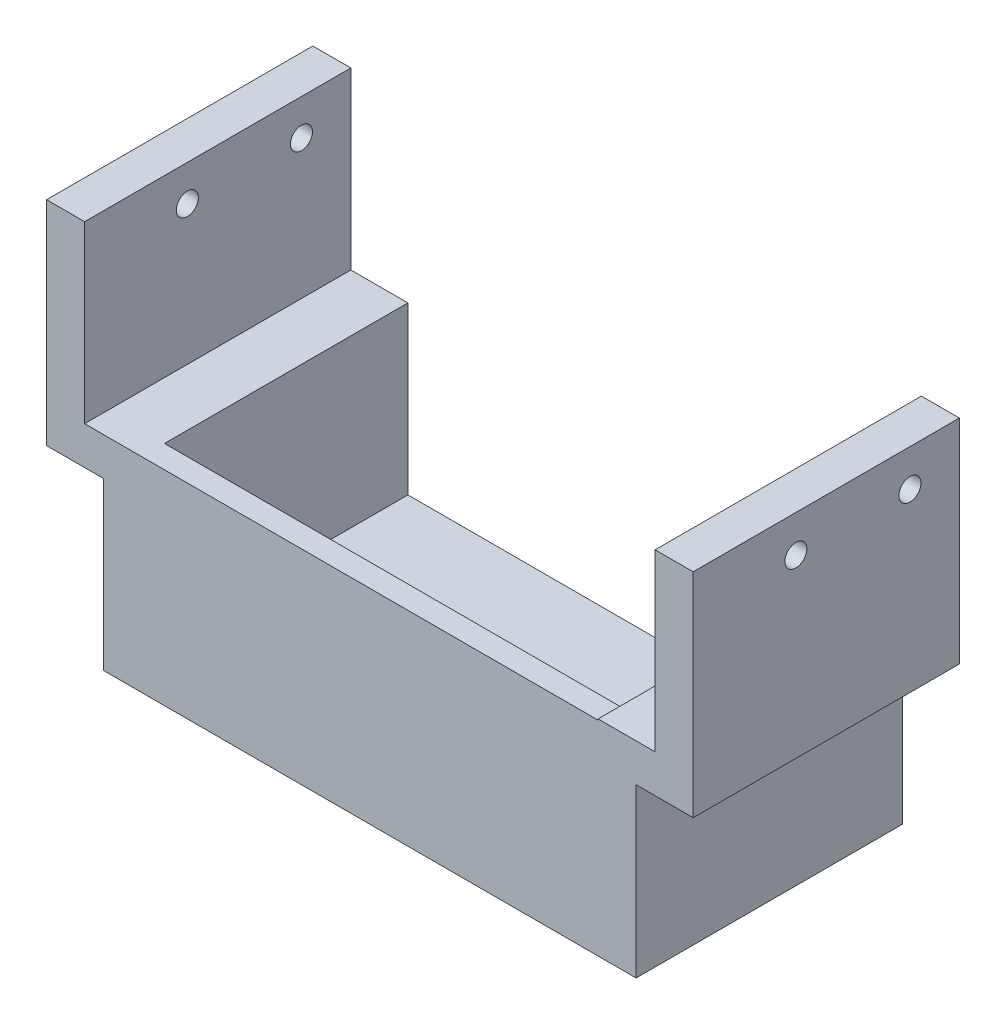
ISO-10303-21;
HEADER;
FILE_DESCRIPTION(('STEP AP214'),'2;1');
FILE_NAME('part.step','',(''),(''),'','','');
FILE_SCHEMA(('AUTOMOTIVE_DESIGN { 1 0 10303 214 1 1 1 1 }'));
ENDSEC;
DATA;
#1=APPLICATION_CONTEXT('core data for automotive mechanical design processes');
#2=APPLICATION_PROTOCOL_DEFINITION('international standard','automotive_design',2000,#1);
#3=PRODUCT_CONTEXT('',#1,'mechanical');
#4=PRODUCT('Part','Part','',(#3));
#5=PRODUCT_RELATED_PRODUCT_CATEGORY('part','',(#4));
#6=PRODUCT_DEFINITION_FORMATION('','',#4);
#7=PRODUCT_DEFINITION_CONTEXT('part definition',#1,'design');
#8=PRODUCT_DEFINITION('design','',#6,#7);
#9=PRODUCT_DEFINITION_SHAPE('','',#8);
#10=(LENGTH_UNIT() NAMED_UNIT(*) SI_UNIT(.MILLI.,.METRE.));
#11=(NAMED_UNIT(*) PLANE_ANGLE_UNIT() SI_UNIT($,.RADIAN.));
#12=(NAMED_UNIT(*) SI_UNIT($,.STERADIAN.) SOLID_ANGLE_UNIT());
#13=UNCERTAINTY_MEASURE_WITH_UNIT(LENGTH_MEASURE(1.E-05),#10,'distance_accuracy_value','');
#14=(GEOMETRIC_REPRESENTATION_CONTEXT(3) GLOBAL_UNCERTAINTY_ASSIGNED_CONTEXT((#13)) GLOBAL_UNIT_ASSIGNED_CONTEXT((#10,
#11,#12)) REPRESENTATION_CONTEXT('',''));
#15=CARTESIAN_POINT('',(0.,0.,0.));
#16=DIRECTION('',(0.,0.,1.));
#17=DIRECTION('',(1.,0.,0.));
#18=AXIS2_PLACEMENT_3D('',#15,#16,#17);
#19=CARTESIAN_POINT('',(-21.2936117470493,10.1255391247049,35.));
#20=DIRECTION('',(1.,0.,0.));
#21=DIRECTION('',(0.,1.,0.));
#22=AXIS2_PLACEMENT_3D('',#19,#20,#21);
#23=PLANE('',#22);
#24=DIRECTION('',(0.,0.,-1.));
#25=VECTOR('',#24,1.);
#26=CARTESIAN_POINT('',(-21.2936117470493,10.1255391247049,35.));
#27=LINE('',#26,#25);
#28=CARTESIAN_POINT('',(-21.2936117470493,10.1255391247049,32.));
#29=VERTEX_POINT('',#28);
#30=CARTESIAN_POINT('',(-21.2936117470493,10.1255391247049,0.));
#31=VERTEX_POINT('',#30);
#32=EDGE_CURVE('E41',#29,#31,#27,.T.);
#33=ORIENTED_EDGE('',*,*,#32,.F.);
#34=DIRECTION('',(0.,-1.,0.));
#35=VECTOR('',#34,1.);
#36=CARTESIAN_POINT('',(-21.2936117470493,10.1255391247049,32.));
#37=LINE('',#36,#35);
#38=CARTESIAN_POINT('',(-21.2936117470493,-11.7323242546938,32.));
#39=VERTEX_POINT('',#38);
#40=EDGE_CURVE('E207',#29,#39,#37,.T.);
#41=ORIENTED_EDGE('',*,*,#40,.T.);
#42=DIRECTION('',(0.,0.,-1.));
#43=VECTOR('',#42,1.);
#44=CARTESIAN_POINT('',(-21.2936117470493,-11.7323242546938,35.));
#45=LINE('',#44,#43);
#46=CARTESIAN_POINT('',(-21.2936117470493,-11.7323242546938,0.));
#47=VERTEX_POINT('',#46);
#48=EDGE_CURVE('E202',#39,#47,#45,.T.);
#49=ORIENTED_EDGE('',*,*,#48,.T.);
#50=DIRECTION('',(0.,-1.,0.));
#51=VECTOR('',#50,1.);
#52=CARTESIAN_POINT('',(-21.2936117470493,10.1255391247049,0.));
#53=LINE('',#52,#51);
#54=EDGE_CURVE('E203',#31,#47,#53,.T.);
#55=ORIENTED_EDGE('',*,*,#54,.F.);
#56=EDGE_LOOP('',(#33,#41,#49,#55));
#57=FACE_BOUND('',#56,.T.);
#58=ADVANCED_FACE('F33',(#57),#23,.T.);
#59=CARTESIAN_POINT('',(-21.2936117470493,-11.7323242546938,35.));
#60=DIRECTION('',(0.,1.,0.));
#61=DIRECTION('',(0.,0.,1.));
#62=AXIS2_PLACEMENT_3D('',#59,#60,#61);
#63=PLANE('',#62);
#64=ORIENTED_EDGE('',*,*,#48,.F.);
#65=DIRECTION('',(1.,0.,0.));
#66=VECTOR('',#65,1.);
#67=CARTESIAN_POINT('',(-21.2936117470493,-11.7323242546938,32.));
#68=LINE('',#67,#66);
#69=CARTESIAN_POINT('',(38.7063882529507,-11.7323242546938,32.));
#70=VERTEX_POINT('',#69);
#71=EDGE_CURVE('E11',#39,#70,#68,.T.);
#72=ORIENTED_EDGE('',*,*,#71,.T.);
#73=DIRECTION('',(0.,0.,-1.));
#74=VECTOR('',#73,1.);
#75=CARTESIAN_POINT('',(38.7063882529507,-11.7323242546938,35.));
#76=LINE('',#75,#74);
#77=CARTESIAN_POINT('',(38.7063882529507,-11.7323242546938,0.));
#78=VERTEX_POINT('',#77);
#79=EDGE_CURVE('E163',#70,#78,#76,.T.);
#80=ORIENTED_EDGE('',*,*,#79,.T.);
#81=DIRECTION('',(1.,0.,0.));
#82=VECTOR('',#81,1.);
#83=CARTESIAN_POINT('',(-21.2936117470493,-11.7323242546938,0.));
#84=LINE('',#83,#82);
#85=EDGE_CURVE('E206',#47,#78,#84,.T.);
#86=ORIENTED_EDGE('',*,*,#85,.F.);
#87=EDGE_LOOP('',(#64,#72,#80,#86));
#88=FACE_BOUND('',#87,.T.);
#89=ADVANCED_FACE('F302',(#88),#63,.T.);
#90=CARTESIAN_POINT('',(-21.2936117470493,10.1255391247049,35.));
#91=DIRECTION('',(0.,-1.,0.));
#92=DIRECTION('',(1.,0.,0.));
#93=AXIS2_PLACEMENT_3D('',#90,#91,#92);
#94=PLANE('',#93);
#95=DIRECTION('',(-1.,0.,0.));
#96=VECTOR('',#95,1.);
#97=CARTESIAN_POINT('',(-21.2936117470493,10.1255391247049,35.));
#98=LINE('',#97,#96);
#99=CARTESIAN_POINT('',(38.7063882529507,10.1255391247049,35.));
#100=VERTEX_POINT('',#99);
#101=CARTESIAN_POINT('',(-28.7936117470493,10.1255391247049,35.));
#102=VERTEX_POINT('',#101);
#103=EDGE_CURVE('E200',#100,#102,#98,.T.);
#104=ORIENTED_EDGE('',*,*,#103,.F.);
#105=DIRECTION('',(0.,0.,1.));
#106=VECTOR('',#105,1.);
#107=CARTESIAN_POINT('',(38.7063882529507,10.1255391247049,35.));
#108=LINE('',#107,#106);
#109=CARTESIAN_POINT('',(38.7063882529507,10.1255391247049,32.));
#110=VERTEX_POINT('',#109);
#111=EDGE_CURVE('E168',#110,#100,#108,.T.);
#112=ORIENTED_EDGE('',*,*,#111,.F.);
#113=DIRECTION('',(-1.,0.,0.));
#114=VECTOR('',#113,1.);
#115=CARTESIAN_POINT('',(-33.7936117470493,10.1255391247049,32.));
#116=LINE('',#115,#114);
#117=EDGE_CURVE('E280',#110,#29,#116,.T.);
#118=ORIENTED_EDGE('',*,*,#117,.T.);
#119=ORIENTED_EDGE('',*,*,#32,.T.);
#120=DIRECTION('',(-1.,0.,0.));
#121=VECTOR('',#120,1.);
#122=CARTESIAN_POINT('',(-21.2936117470493,10.1255391247049,0.));
#123=LINE('',#122,#121);
#124=CARTESIAN_POINT('',(-28.7936117470493,10.1255391247049,0.));
#125=VERTEX_POINT('',#124);
#126=EDGE_CURVE('E170',#31,#125,#123,.T.);
#127=ORIENTED_EDGE('',*,*,#126,.T.);
#128=DIRECTION('',(0.,0.,-1.));
#129=VECTOR('',#128,1.);
#130=CARTESIAN_POINT('',(-28.7936117470493,10.1255391247049,35.));
#131=LINE('',#130,#129);
#132=EDGE_CURVE('E246',#102,#125,#131,.T.);
#133=ORIENTED_EDGE('',*,*,#132,.F.);
#134=EDGE_LOOP('',(#104,#112,#118,#119,#127,#133));
#135=FACE_BOUND('',#134,.T.);
#136=ADVANCED_FACE('F305',(#135),#94,.F.);
#137=CARTESIAN_POINT('',(-28.7936117470493,10.1255391247049,35.));
#138=DIRECTION('',(-1.,0.,0.));
#139=DIRECTION('',(0.,-1.,0.));
#140=AXIS2_PLACEMENT_3D('',#137,#138,#139);
#141=PLANE('',#140);
#142=CARTESIAN_POINT('',(-28.7936117470493,28.4076757453062,21.5));
#143=DIRECTION('',(-1.,0.,0.));
#144=DIRECTION('',(0.,-1.,0.));
#145=AXIS2_PLACEMENT_3D('',#142,#143,#144);
#146=CIRCLE('',#145,1.45);
#147=CARTESIAN_POINT('',(-28.7936117470493,26.9576757453062,21.5));
#148=VERTEX_POINT('',#147);
#149=EDGE_CURVE('E288',#148,#148,#146,.T.);
#150=ORIENTED_EDGE('',*,*,#149,.T.);
#151=EDGE_LOOP('',(#150));
#152=FACE_BOUND('',#151,.T.);
#153=CARTESIAN_POINT('',(-28.7936117470493,28.4076757453062,6.50000000000001));
#154=DIRECTION('',(-1.,0.,0.));
#155=DIRECTION('',(0.,-1.,0.));
#156=AXIS2_PLACEMENT_3D('',#153,#154,#155);
#157=CIRCLE('',#156,1.45);
#158=CARTESIAN_POINT('',(-28.7936117470493,26.9576757453062,6.50000000000001));
#159=VERTEX_POINT('',#158);
#160=EDGE_CURVE('E275',#159,#159,#157,.T.);
#161=ORIENTED_EDGE('',*,*,#160,.T.);
#162=EDGE_LOOP('',(#161));
#163=FACE_BOUND('',#162,.T.);
#164=DIRECTION('',(0.,1.,0.));
#165=VECTOR('',#164,1.);
#166=CARTESIAN_POINT('',(-28.7936117470493,10.1255391247049,0.));
#167=LINE('',#166,#165);
#168=CARTESIAN_POINT('',(-28.7936117470493,33.1255391247049,0.));
#169=VERTEX_POINT('',#168);
#170=EDGE_CURVE('E241',#125,#169,#167,.T.);
#171=ORIENTED_EDGE('',*,*,#170,.T.);
#172=DIRECTION('',(0.,0.,-1.));
#173=VECTOR('',#172,1.);
#174=CARTESIAN_POINT('',(-28.7936117470493,33.1255391247049,35.));
#175=LINE('',#174,#173);
#176=CARTESIAN_POINT('',(-28.7936117470493,33.1255391247049,35.));
#177=VERTEX_POINT('',#176);
#178=EDGE_CURVE('E248',#177,#169,#175,.T.);
#179=ORIENTED_EDGE('',*,*,#178,.F.);
#180=DIRECTION('',(0.,1.,0.));
#181=VECTOR('',#180,1.);
#182=CARTESIAN_POINT('',(-28.7936117470493,10.1255391247049,35.));
#183=LINE('',#182,#181);
#184=EDGE_CURVE('E198',#102,#177,#183,.T.);
#185=ORIENTED_EDGE('',*,*,#184,.F.);
#186=ORIENTED_EDGE('',*,*,#132,.T.);
#187=EDGE_LOOP('',(#171,#179,#185,#186));
#188=FACE_BOUND('',#187,.T.);
#189=ADVANCED_FACE('F313',(#152,#163,#188),#141,.F.);
#190=CARTESIAN_POINT('',(-28.7936117470493,33.1255391247049,35.));
#191=DIRECTION('',(0.,-1.,0.));
#192=DIRECTION('',(0.,0.,-1.));
#193=AXIS2_PLACEMENT_3D('',#190,#191,#192);
#194=PLANE('',#193);
#195=DIRECTION('',(-1.,0.,0.));
#196=VECTOR('',#195,1.);
#197=CARTESIAN_POINT('',(-28.7936117470493,33.1255391247049,0.));
#198=LINE('',#197,#196);
#199=CARTESIAN_POINT('',(-33.7936117470493,33.1255391247049,0.));
#200=VERTEX_POINT('',#199);
#201=EDGE_CURVE('E239',#169,#200,#198,.T.);
#202=ORIENTED_EDGE('',*,*,#201,.T.);
#203=DIRECTION('',(0.,0.,-1.));
#204=VECTOR('',#203,1.);
#205=CARTESIAN_POINT('',(-33.7936117470493,33.1255391247049,35.));
#206=LINE('',#205,#204);
#207=CARTESIAN_POINT('',(-33.7936117470493,33.1255391247049,35.));
#208=VERTEX_POINT('',#207);
#209=EDGE_CURVE('E251',#208,#200,#206,.T.);
#210=ORIENTED_EDGE('',*,*,#209,.F.);
#211=DIRECTION('',(-1.,0.,0.));
#212=VECTOR('',#211,1.);
#213=CARTESIAN_POINT('',(-28.7936117470493,33.1255391247049,35.));
#214=LINE('',#213,#212);
#215=EDGE_CURVE('E196',#177,#208,#214,.T.);
#216=ORIENTED_EDGE('',*,*,#215,.F.);
#217=ORIENTED_EDGE('',*,*,#178,.T.);
#218=EDGE_LOOP('',(#202,#210,#216,#217));
#219=FACE_BOUND('',#218,.T.);
#220=ADVANCED_FACE('F317',(#219),#194,.F.);
#221=CARTESIAN_POINT('',(-33.7936117470493,33.1255391247049,35.));
#222=DIRECTION('',(1.,0.,0.));
#223=DIRECTION('',(0.,1.,0.));
#224=AXIS2_PLACEMENT_3D('',#221,#222,#223);
#225=PLANE('',#224);
#226=CARTESIAN_POINT('',(-33.7936117470493,28.4076757453062,21.5));
#227=DIRECTION('',(-1.,0.,0.));
#228=DIRECTION('',(0.,-1.,0.));
#229=AXIS2_PLACEMENT_3D('',#226,#227,#228);
#230=CIRCLE('',#229,1.45);
#231=CARTESIAN_POINT('',(-33.7936117470493,26.9576757453062,21.5));
#232=VERTEX_POINT('',#231);
#233=EDGE_CURVE('E571',#232,#232,#230,.T.);
#234=ORIENTED_EDGE('',*,*,#233,.F.);
#235=EDGE_LOOP('',(#234));
#236=FACE_BOUND('',#235,.T.);
#237=CARTESIAN_POINT('',(-33.7936117470493,28.4076757453062,6.50000000000001));
#238=DIRECTION('',(-1.,0.,0.));
#239=DIRECTION('',(0.,-1.,0.));
#240=AXIS2_PLACEMENT_3D('',#237,#238,#239);
#241=CIRCLE('',#240,1.45);
#242=CARTESIAN_POINT('',(-33.7936117470493,26.9576757453062,6.50000000000001));
#243=VERTEX_POINT('',#242);
#244=EDGE_CURVE('E283',#243,#243,#241,.T.);
#245=ORIENTED_EDGE('',*,*,#244,.F.);
#246=EDGE_LOOP('',(#245));
#247=FACE_BOUND('',#246,.T.);
#248=DIRECTION('',(0.,0.,-1.));
#249=VECTOR('',#248,1.);
#250=CARTESIAN_POINT('',(-33.7936117470493,5.1255391247049,35.));
#251=LINE('',#250,#249);
#252=CARTESIAN_POINT('',(-33.7936117470493,5.1255391247049,35.));
#253=VERTEX_POINT('',#252);
#254=CARTESIAN_POINT('',(-33.7936117470493,5.1255391247049,0.));
#255=VERTEX_POINT('',#254);
#256=EDGE_CURVE('E254',#253,#255,#251,.T.);
#257=ORIENTED_EDGE('',*,*,#256,.F.);
#258=DIRECTION('',(0.,-1.,0.));
#259=VECTOR('',#258,1.);
#260=CARTESIAN_POINT('',(-33.7936117470493,33.1255391247049,35.));
#261=LINE('',#260,#259);
#262=EDGE_CURVE('E194',#208,#253,#261,.T.);
#263=ORIENTED_EDGE('',*,*,#262,.F.);
#264=ORIENTED_EDGE('',*,*,#209,.T.);
#265=DIRECTION('',(0.,-1.,0.));
#266=VECTOR('',#265,1.);
#267=CARTESIAN_POINT('',(-33.7936117470493,33.1255391247049,0.));
#268=LINE('',#267,#266);
#269=EDGE_CURVE('E236',#200,#255,#268,.T.);
#270=ORIENTED_EDGE('',*,*,#269,.T.);
#271=EDGE_LOOP('',(#257,#263,#264,#270));
#272=FACE_BOUND('',#271,.T.);
#273=ADVANCED_FACE('F322',(#236,#247,#272),#225,.F.);
#274=CARTESIAN_POINT('',(-33.7936117470493,5.1255391247049,35.));
#275=DIRECTION('',(0.,1.,0.));
#276=DIRECTION('',(0.,0.,1.));
#277=AXIS2_PLACEMENT_3D('',#274,#275,#276);
#278=PLANE('',#277);
#279=ORIENTED_EDGE('',*,*,#256,.T.);
#280=DIRECTION('',(1.,0.,0.));
#281=VECTOR('',#280,1.);
#282=CARTESIAN_POINT('',(-33.7936117470493,5.1255391247049,0.));
#283=LINE('',#282,#281);
#284=CARTESIAN_POINT('',(-26.2936117470493,5.1255391247049,0.));
#285=VERTEX_POINT('',#284);
#286=EDGE_CURVE('E233',#255,#285,#283,.T.);
#287=ORIENTED_EDGE('',*,*,#286,.T.);
#288=DIRECTION('',(0.,0.,-1.));
#289=VECTOR('',#288,1.);
#290=CARTESIAN_POINT('',(-26.2936117470493,5.1255391247049,35.));
#291=LINE('',#290,#289);
#292=CARTESIAN_POINT('',(-26.2936117470493,5.1255391247049,35.));
#293=VERTEX_POINT('',#292);
#294=EDGE_CURVE('E256',#293,#285,#291,.T.);
#295=ORIENTED_EDGE('',*,*,#294,.F.);
#296=DIRECTION('',(1.,0.,0.));
#297=VECTOR('',#296,1.);
#298=CARTESIAN_POINT('',(-33.7936117470493,5.1255391247049,35.));
#299=LINE('',#298,#297);
#300=EDGE_CURVE('E192',#253,#293,#299,.T.);
#301=ORIENTED_EDGE('',*,*,#300,.F.);
#302=EDGE_LOOP('',(#279,#287,#295,#301));
#303=FACE_BOUND('',#302,.T.);
#304=ADVANCED_FACE('F328',(#303),#278,.F.);
#305=CARTESIAN_POINT('',(-26.2936117470493,5.1255391247049,35.));
#306=DIRECTION('',(1.,0.,0.));
#307=DIRECTION('',(0.,1.,0.));
#308=AXIS2_PLACEMENT_3D('',#305,#306,#307);
#309=PLANE('',#308);
#310=ORIENTED_EDGE('',*,*,#294,.T.);
#311=DIRECTION('',(0.,-1.,0.));
#312=VECTOR('',#311,1.);
#313=CARTESIAN_POINT('',(-26.2936117470493,5.1255391247049,0.));
#314=LINE('',#313,#312);
#315=CARTESIAN_POINT('',(-26.2936117470493,-16.7323242546938,0.));
#316=VERTEX_POINT('',#315);
#317=EDGE_CURVE('E230',#285,#316,#314,.T.);
#318=ORIENTED_EDGE('',*,*,#317,.T.);
#319=DIRECTION('',(0.,0.,-1.));
#320=VECTOR('',#319,1.);
#321=CARTESIAN_POINT('',(-26.2936117470493,-16.7323242546938,35.));
#322=LINE('',#321,#320);
#323=CARTESIAN_POINT('',(-26.2936117470493,-16.7323242546938,35.));
#324=VERTEX_POINT('',#323);
#325=EDGE_CURVE('E258',#324,#316,#322,.T.);
#326=ORIENTED_EDGE('',*,*,#325,.F.);
#327=DIRECTION('',(0.,-1.,0.));
#328=VECTOR('',#327,1.);
#329=CARTESIAN_POINT('',(-26.2936117470493,5.1255391247049,35.));
#330=LINE('',#329,#328);
#331=EDGE_CURVE('E190',#293,#324,#330,.T.);
#332=ORIENTED_EDGE('',*,*,#331,.F.);
#333=EDGE_LOOP('',(#310,#318,#326,#332));
#334=FACE_BOUND('',#333,.T.);
#335=ADVANCED_FACE('F332',(#334),#309,.F.);
#336=CARTESIAN_POINT('',(-26.2936117470493,-16.7323242546938,35.));
#337=DIRECTION('',(0.,1.,0.));
#338=DIRECTION('',(0.,0.,1.));
#339=AXIS2_PLACEMENT_3D('',#336,#337,#338);
#340=PLANE('',#339);
#341=ORIENTED_EDGE('',*,*,#325,.T.);
#342=DIRECTION('',(1.,0.,0.));
#343=VECTOR('',#342,1.);
#344=CARTESIAN_POINT('',(-26.2936117470493,-16.7323242546938,0.));
#345=LINE('',#344,#343);
#346=CARTESIAN_POINT('',(43.7063882529507,-16.7323242546938,0.));
#347=VERTEX_POINT('',#346);
#348=EDGE_CURVE('E227',#316,#347,#345,.T.);
#349=ORIENTED_EDGE('',*,*,#348,.T.);
#350=DIRECTION('',(0.,0.,-1.));
#351=VECTOR('',#350,1.);
#352=CARTESIAN_POINT('',(43.7063882529507,-16.7323242546938,35.));
#353=LINE('',#352,#351);
#354=CARTESIAN_POINT('',(43.7063882529507,-16.7323242546938,35.));
#355=VERTEX_POINT('',#354);
#356=EDGE_CURVE('E260',#355,#347,#353,.T.);
#357=ORIENTED_EDGE('',*,*,#356,.F.);
#358=DIRECTION('',(1.,0.,0.));
#359=VECTOR('',#358,1.);
#360=CARTESIAN_POINT('',(-26.2936117470493,-16.7323242546938,35.));
#361=LINE('',#360,#359);
#362=EDGE_CURVE('E188',#324,#355,#361,.T.);
#363=ORIENTED_EDGE('',*,*,#362,.F.);
#364=EDGE_LOOP('',(#341,#349,#357,#363));
#365=FACE_BOUND('',#364,.T.);
#366=ADVANCED_FACE('F337',(#365),#340,.F.);
#367=CARTESIAN_POINT('',(43.7063882529507,-16.7323242546938,35.));
#368=DIRECTION('',(-1.,0.,0.));
#369=DIRECTION('',(0.,0.,1.));
#370=AXIS2_PLACEMENT_3D('',#367,#368,#369);
#371=PLANE('',#370);
#372=ORIENTED_EDGE('',*,*,#356,.T.);
#373=DIRECTION('',(0.,1.,0.));
#374=VECTOR('',#373,1.);
#375=CARTESIAN_POINT('',(43.7063882529507,-16.7323242546938,0.));
#376=LINE('',#375,#374);
#377=CARTESIAN_POINT('',(43.7063882529507,5.26767574530624,0.));
#378=VERTEX_POINT('',#377);
#379=EDGE_CURVE('E224',#347,#378,#376,.T.);
#380=ORIENTED_EDGE('',*,*,#379,.T.);
#381=DIRECTION('',(0.,0.,-1.));
#382=VECTOR('',#381,1.);
#383=CARTESIAN_POINT('',(43.7063882529507,5.26767574530624,35.));
#384=LINE('',#383,#382);
#385=CARTESIAN_POINT('',(43.7063882529507,5.26767574530624,35.));
#386=VERTEX_POINT('',#385);
#387=EDGE_CURVE('E262',#386,#378,#384,.T.);
#388=ORIENTED_EDGE('',*,*,#387,.F.);
#389=DIRECTION('',(0.,1.,0.));
#390=VECTOR('',#389,1.);
#391=CARTESIAN_POINT('',(43.7063882529507,-16.7323242546938,35.));
#392=LINE('',#391,#390);
#393=EDGE_CURVE('E186',#355,#386,#392,.T.);
#394=ORIENTED_EDGE('',*,*,#393,.F.);
#395=EDGE_LOOP('',(#372,#380,#388,#394));
#396=FACE_BOUND('',#395,.T.);
#397=ADVANCED_FACE('F343',(#396),#371,.F.);
#398=CARTESIAN_POINT('',(43.7063882529507,5.26767574530624,35.));
#399=DIRECTION('',(0.,1.,0.));
#400=DIRECTION('',(0.,0.,1.));
#401=AXIS2_PLACEMENT_3D('',#398,#399,#400);
#402=PLANE('',#401);
#403=ORIENTED_EDGE('',*,*,#387,.T.);
#404=DIRECTION('',(1.,0.,0.));
#405=VECTOR('',#404,1.);
#406=CARTESIAN_POINT('',(43.7063882529507,5.26767574530624,0.));
#407=LINE('',#406,#405);
#408=CARTESIAN_POINT('',(51.2063882529507,5.26767574530624,0.));
#409=VERTEX_POINT('',#408);
#410=EDGE_CURVE('E221',#378,#409,#407,.T.);
#411=ORIENTED_EDGE('',*,*,#410,.T.);
#412=DIRECTION('',(0.,0.,-1.));
#413=VECTOR('',#412,1.);
#414=CARTESIAN_POINT('',(51.2063882529507,5.26767574530624,35.));
#415=LINE('',#414,#413);
#416=CARTESIAN_POINT('',(51.2063882529507,5.26767574530624,35.));
#417=VERTEX_POINT('',#416);
#418=EDGE_CURVE('E264',#417,#409,#415,.T.);
#419=ORIENTED_EDGE('',*,*,#418,.F.);
#420=DIRECTION('',(1.,0.,0.));
#421=VECTOR('',#420,1.);
#422=CARTESIAN_POINT('',(43.7063882529507,5.26767574530624,35.));
#423=LINE('',#422,#421);
#424=EDGE_CURVE('E184',#386,#417,#423,.T.);
#425=ORIENTED_EDGE('',*,*,#424,.F.);
#426=EDGE_LOOP('',(#403,#411,#419,#425));
#427=FACE_BOUND('',#426,.T.);
#428=ADVANCED_FACE('F347',(#427),#402,.F.);
#429=CARTESIAN_POINT('',(51.2063882529507,5.26767574530624,35.));
#430=DIRECTION('',(-1.,0.,0.));
#431=DIRECTION('',(0.,0.,1.));
#432=AXIS2_PLACEMENT_3D('',#429,#430,#431);
#433=PLANE('',#432);
#434=CARTESIAN_POINT('',(51.2063882529507,28.4076757453062,21.5));
#435=DIRECTION('',(-1.,0.,0.));
#436=DIRECTION('',(0.,-1.,0.));
#437=AXIS2_PLACEMENT_3D('',#434,#435,#436);
#438=CIRCLE('',#437,1.45);
#439=CARTESIAN_POINT('',(51.2063882529507,26.9576757453062,21.5));
#440=VERTEX_POINT('',#439);
#441=EDGE_CURVE('E574',#440,#440,#438,.T.);
#442=ORIENTED_EDGE('',*,*,#441,.T.);
#443=EDGE_LOOP('',(#442));
#444=FACE_BOUND('',#443,.T.);
#445=CARTESIAN_POINT('',(51.2063882529507,28.4076757453062,6.50000000000001));
#446=DIRECTION('',(-1.,0.,0.));
#447=DIRECTION('',(0.,-1.,0.));
#448=AXIS2_PLACEMENT_3D('',#445,#446,#447);
#449=CIRCLE('',#448,1.45);
#450=CARTESIAN_POINT('',(51.2063882529507,26.9576757453062,6.50000000000001));
#451=VERTEX_POINT('',#450);
#452=EDGE_CURVE('E276',#451,#451,#449,.T.);
#453=ORIENTED_EDGE('',*,*,#452,.T.);
#454=EDGE_LOOP('',(#453));
#455=FACE_BOUND('',#454,.T.);
#456=DIRECTION('',(0.,0.,-1.));
#457=VECTOR('',#456,1.);
#458=CARTESIAN_POINT('',(51.2063882529507,33.2676757453062,35.));
#459=LINE('',#458,#457);
#460=CARTESIAN_POINT('',(51.2063882529507,33.2676757453062,35.));
#461=VERTEX_POINT('',#460);
#462=CARTESIAN_POINT('',(51.2063882529507,33.2676757453062,0.));
#463=VERTEX_POINT('',#462);
#464=EDGE_CURVE('E266',#461,#463,#459,.T.);
#465=ORIENTED_EDGE('',*,*,#464,.F.);
#466=DIRECTION('',(0.,1.,0.));
#467=VECTOR('',#466,1.);
#468=CARTESIAN_POINT('',(51.2063882529507,5.26767574530624,35.));
#469=LINE('',#468,#467);
#470=EDGE_CURVE('E182',#417,#461,#469,.T.);
#471=ORIENTED_EDGE('',*,*,#470,.F.);
#472=ORIENTED_EDGE('',*,*,#418,.T.);
#473=DIRECTION('',(0.,1.,0.));
#474=VECTOR('',#473,1.);
#475=CARTESIAN_POINT('',(51.2063882529507,5.26767574530624,0.));
#476=LINE('',#475,#474);
#477=EDGE_CURVE('E219',#409,#463,#476,.T.);
#478=ORIENTED_EDGE('',*,*,#477,.T.);
#479=EDGE_LOOP('',(#465,#471,#472,#478));
#480=FACE_BOUND('',#479,.T.);
#481=ADVANCED_FACE('F352',(#444,#455,#480),#433,.F.);
#482=CARTESIAN_POINT('',(51.2063882529507,33.2676757453062,35.));
#483=DIRECTION('',(0.,-1.,0.));
#484=DIRECTION('',(0.,0.,-1.));
#485=AXIS2_PLACEMENT_3D('',#482,#483,#484);
#486=PLANE('',#485);
#487=DIRECTION('',(-1.,0.,0.));
#488=VECTOR('',#487,1.);
#489=CARTESIAN_POINT('',(51.2063882529507,33.2676757453062,0.));
#490=LINE('',#489,#488);
#491=CARTESIAN_POINT('',(46.2063882529507,33.2676757453062,0.));
#492=VERTEX_POINT('',#491);
#493=EDGE_CURVE('E216',#463,#492,#490,.T.);
#494=ORIENTED_EDGE('',*,*,#493,.T.);
#495=DIRECTION('',(0.,0.,-1.));
#496=VECTOR('',#495,1.);
#497=CARTESIAN_POINT('',(46.2063882529507,33.2676757453062,35.));
#498=LINE('',#497,#496);
#499=CARTESIAN_POINT('',(46.2063882529507,33.2676757453062,35.));
#500=VERTEX_POINT('',#499);
#501=EDGE_CURVE('E269',#500,#492,#498,.T.);
#502=ORIENTED_EDGE('',*,*,#501,.F.);
#503=DIRECTION('',(-1.,0.,0.));
#504=VECTOR('',#503,1.);
#505=CARTESIAN_POINT('',(51.2063882529507,33.2676757453062,35.));
#506=LINE('',#505,#504);
#507=EDGE_CURVE('E177',#461,#500,#506,.T.);
#508=ORIENTED_EDGE('',*,*,#507,.F.);
#509=ORIENTED_EDGE('',*,*,#464,.T.);
#510=EDGE_LOOP('',(#494,#502,#508,#509));
#511=FACE_BOUND('',#510,.T.);
#512=ADVANCED_FACE('F356',(#511),#486,.F.);
#513=CARTESIAN_POINT('',(46.2063882529507,10.2676757453062,35.));
#514=DIRECTION('',(-1.,0.,0.));
#515=DIRECTION('',(0.,0.,1.));
#516=AXIS2_PLACEMENT_3D('',#513,#514,#515);
#517=PLANE('',#516);
#518=CARTESIAN_POINT('',(46.2063882529507,28.4076757453062,21.5));
#519=DIRECTION('',(-1.,0.,0.));
#520=DIRECTION('',(0.,0.,1.));
#521=AXIS2_PLACEMENT_3D('',#518,#519,#520);
#522=CIRCLE('',#521,1.45);
#523=CARTESIAN_POINT('',(46.2063882529507,28.4076757453062,22.95));
#524=VERTEX_POINT('',#523);
#525=EDGE_CURVE('E36',#524,#524,#522,.T.);
#526=ORIENTED_EDGE('',*,*,#525,.F.);
#527=EDGE_LOOP('',(#526));
#528=FACE_BOUND('',#527,.T.);
#529=CARTESIAN_POINT('',(46.2063882529507,28.4076757453062,6.50000000000001));
#530=DIRECTION('',(-1.,0.,0.));
#531=DIRECTION('',(0.,0.,1.));
#532=AXIS2_PLACEMENT_3D('',#529,#530,#531);
#533=CIRCLE('',#532,1.45);
#534=CARTESIAN_POINT('',(46.2063882529507,28.4076757453062,7.95000000000001));
#535=VERTEX_POINT('',#534);
#536=EDGE_CURVE('E273',#535,#535,#533,.T.);
#537=ORIENTED_EDGE('',*,*,#536,.F.);
#538=EDGE_LOOP('',(#537));
#539=FACE_BOUND('',#538,.T.);
#540=DIRECTION('',(0.,1.,0.));
#541=VECTOR('',#540,1.);
#542=CARTESIAN_POINT('',(46.2063882529507,10.2676757453062,0.));
#543=LINE('',#542,#541);
#544=CARTESIAN_POINT('',(46.2063882529507,10.2676757453062,0.));
#545=VERTEX_POINT('',#544);
#546=EDGE_CURVE('E213',#545,#492,#543,.T.);
#547=ORIENTED_EDGE('',*,*,#546,.F.);
#548=DIRECTION('',(0.,0.,-1.));
#549=VECTOR('',#548,1.);
#550=CARTESIAN_POINT('',(46.2063882529507,10.2676757453062,35.));
#551=LINE('',#550,#549);
#552=CARTESIAN_POINT('',(46.2063882529507,10.2676757453062,35.));
#553=VERTEX_POINT('',#552);
#554=EDGE_CURVE('E162',#553,#545,#551,.T.);
#555=ORIENTED_EDGE('',*,*,#554,.F.);
#556=DIRECTION('',(0.,1.,0.));
#557=VECTOR('',#556,1.);
#558=CARTESIAN_POINT('',(46.2063882529507,10.2676757453062,35.));
#559=LINE('',#558,#557);
#560=EDGE_CURVE('E175',#553,#500,#559,.T.);
#561=ORIENTED_EDGE('',*,*,#560,.T.);
#562=ORIENTED_EDGE('',*,*,#501,.T.);
#563=EDGE_LOOP('',(#547,#555,#561,#562));
#564=FACE_BOUND('',#563,.T.);
#565=ADVANCED_FACE('F360',(#528,#539,#564),#517,.T.);
#566=CARTESIAN_POINT('',(38.7063882529507,10.2676757453062,35.));
#567=DIRECTION('',(0.,1.,0.));
#568=DIRECTION('',(-1.,0.,0.));
#569=AXIS2_PLACEMENT_3D('',#566,#567,#568);
#570=PLANE('',#569);
#571=DIRECTION('',(1.,0.,0.));
#572=VECTOR('',#571,1.);
#573=CARTESIAN_POINT('',(38.7063882529507,10.2676757453062,0.));
#574=LINE('',#573,#572);
#575=CARTESIAN_POINT('',(38.7063882529507,10.2676757453062,0.));
#576=VERTEX_POINT('',#575);
#577=EDGE_CURVE('E159',#576,#545,#574,.T.);
#578=ORIENTED_EDGE('',*,*,#577,.F.);
#579=DIRECTION('',(0.,0.,-1.));
#580=VECTOR('',#579,1.);
#581=CARTESIAN_POINT('',(38.7063882529507,10.2676757453062,35.));
#582=LINE('',#581,#580);
#583=CARTESIAN_POINT('',(38.7063882529507,10.2676757453062,35.));
#584=VERTEX_POINT('',#583);
#585=EDGE_CURVE('E153',#584,#576,#582,.T.);
#586=ORIENTED_EDGE('',*,*,#585,.F.);
#587=DIRECTION('',(1.,0.,0.));
#588=VECTOR('',#587,1.);
#589=CARTESIAN_POINT('',(38.7063882529507,10.2676757453062,35.));
#590=LINE('',#589,#588);
#591=EDGE_CURVE('E157',#584,#553,#590,.T.);
#592=ORIENTED_EDGE('',*,*,#591,.T.);
#593=ORIENTED_EDGE('',*,*,#554,.T.);
#594=EDGE_LOOP('',(#578,#586,#592,#593));
#595=FACE_BOUND('',#594,.T.);
#596=ADVANCED_FACE('F155',(#595),#570,.T.);
#597=CARTESIAN_POINT('',(38.7063882529507,10.2676757453062,35.));
#598=DIRECTION('',(1.,0.,0.));
#599=DIRECTION('',(0.,0.,-1.));
#600=AXIS2_PLACEMENT_3D('',#597,#598,#599);
#601=PLANE('',#600);
#602=DIRECTION('',(0.,-1.,0.));
#603=VECTOR('',#602,1.);
#604=CARTESIAN_POINT('',(38.7063882529507,10.2676757453062,32.));
#605=LINE('',#604,#603);
#606=EDGE_CURVE('E56',#110,#70,#605,.T.);
#607=ORIENTED_EDGE('',*,*,#606,.F.);
#608=ORIENTED_EDGE('',*,*,#111,.T.);
#609=DIRECTION('',(0.,-1.,0.));
#610=VECTOR('',#609,1.);
#611=CARTESIAN_POINT('',(38.7063882529507,10.2676757453062,35.));
#612=LINE('',#611,#610);
#613=EDGE_CURVE('E166',#584,#100,#612,.T.);
#614=ORIENTED_EDGE('',*,*,#613,.F.);
#615=ORIENTED_EDGE('',*,*,#585,.T.);
#616=DIRECTION('',(0.,-1.,0.));
#617=VECTOR('',#616,1.);
#618=CARTESIAN_POINT('',(38.7063882529507,10.2676757453062,0.));
#619=LINE('',#618,#617);
#620=EDGE_CURVE('E210',#576,#78,#619,.T.);
#621=ORIENTED_EDGE('',*,*,#620,.T.);
#622=ORIENTED_EDGE('',*,*,#79,.F.);
#623=EDGE_LOOP('',(#607,#608,#614,#615,#621,#622));
#624=FACE_BOUND('',#623,.T.);
#625=ADVANCED_FACE('F167',(#624),#601,.F.);
#626=CARTESIAN_POINT('',(0.,0.,35.));
#627=DIRECTION('',(0.,0.,1.));
#628=DIRECTION('',(1.,0.,0.));
#629=AXIS2_PLACEMENT_3D('',#626,#627,#628);
#630=PLANE('',#629);
#631=ORIENTED_EDGE('',*,*,#262,.T.);
#632=ORIENTED_EDGE('',*,*,#300,.T.);
#633=ORIENTED_EDGE('',*,*,#331,.T.);
#634=ORIENTED_EDGE('',*,*,#362,.T.);
#635=ORIENTED_EDGE('',*,*,#393,.T.);
#636=ORIENTED_EDGE('',*,*,#424,.T.);
#637=ORIENTED_EDGE('',*,*,#470,.T.);
#638=ORIENTED_EDGE('',*,*,#507,.T.);
#639=ORIENTED_EDGE('',*,*,#560,.F.);
#640=ORIENTED_EDGE('',*,*,#591,.F.);
#641=ORIENTED_EDGE('',*,*,#613,.T.);
#642=ORIENTED_EDGE('',*,*,#103,.T.);
#643=ORIENTED_EDGE('',*,*,#184,.T.);
#644=ORIENTED_EDGE('',*,*,#215,.T.);
#645=EDGE_LOOP('',(#631,#632,#633,#634,#635,#636,#637,#638,#639,#640,#641,#642,#643,#644));
#646=FACE_BOUND('',#645,.T.);
#647=ADVANCED_FACE('F173',(#646),#630,.T.);
#648=CARTESIAN_POINT('',(0.,0.,0.));
#649=DIRECTION('',(0.,0.,1.));
#650=DIRECTION('',(1.,0.,0.));
#651=AXIS2_PLACEMENT_3D('',#648,#649,#650);
#652=PLANE('',#651);
#653=ORIENTED_EDGE('',*,*,#54,.T.);
#654=ORIENTED_EDGE('',*,*,#85,.T.);
#655=ORIENTED_EDGE('',*,*,#620,.F.);
#656=ORIENTED_EDGE('',*,*,#577,.T.);
#657=ORIENTED_EDGE('',*,*,#546,.T.);
#658=ORIENTED_EDGE('',*,*,#493,.F.);
#659=ORIENTED_EDGE('',*,*,#477,.F.);
#660=ORIENTED_EDGE('',*,*,#410,.F.);
#661=ORIENTED_EDGE('',*,*,#379,.F.);
#662=ORIENTED_EDGE('',*,*,#348,.F.);
#663=ORIENTED_EDGE('',*,*,#317,.F.);
#664=ORIENTED_EDGE('',*,*,#286,.F.);
#665=ORIENTED_EDGE('',*,*,#269,.F.);
#666=ORIENTED_EDGE('',*,*,#201,.F.);
#667=ORIENTED_EDGE('',*,*,#170,.F.);
#668=ORIENTED_EDGE('',*,*,#126,.F.);
#669=EDGE_LOOP('',(#653,#654,#655,#656,#657,#658,#659,#660,#661,#662,#663,#664,#665,#666,#667,#668));
#670=FACE_BOUND('',#669,.T.);
#671=ADVANCED_FACE('F362',(#670),#652,.F.);
#672=CARTESIAN_POINT('',(0.,0.,32.));
#673=DIRECTION('',(0.,0.,1.));
#674=DIRECTION('',(1.,0.,0.));
#675=AXIS2_PLACEMENT_3D('',#672,#673,#674);
#676=PLANE('',#675);
#677=ORIENTED_EDGE('',*,*,#40,.F.);
#678=ORIENTED_EDGE('',*,*,#117,.F.);
#679=ORIENTED_EDGE('',*,*,#606,.T.);
#680=ORIENTED_EDGE('',*,*,#71,.F.);
#681=EDGE_LOOP('',(#677,#678,#679,#680));
#682=FACE_BOUND('',#681,.T.);
#683=ADVANCED_FACE('F303',(#682),#676,.F.);
#684=CARTESIAN_POINT('',(51.2063882529507,28.4076757453062,6.50000000000001));
#685=DIRECTION('',(-1.,0.,0.));
#686=DIRECTION('',(0.,-1.,0.));
#687=AXIS2_PLACEMENT_3D('',#684,#685,#686);
#688=CYLINDRICAL_SURFACE('',#687,1.45);
#689=ORIENTED_EDGE('',*,*,#536,.T.);
#690=EDGE_LOOP('',(#689));
#691=FACE_BOUND('',#690,.T.);
#692=ORIENTED_EDGE('',*,*,#452,.F.);
#693=EDGE_LOOP('',(#692));
#694=FACE_BOUND('',#693,.T.);
#695=ADVANCED_FACE('F369',(#691,#694),#688,.F.);
#696=ORIENTED_EDGE('',*,*,#244,.T.);
#697=EDGE_LOOP('',(#696));
#698=FACE_BOUND('',#697,.T.);
#699=ORIENTED_EDGE('',*,*,#160,.F.);
#700=EDGE_LOOP('',(#699));
#701=FACE_BOUND('',#700,.T.);
#702=ADVANCED_FACE('F417',(#698,#701),#688,.F.);
#703=CARTESIAN_POINT('',(51.2063882529507,28.4076757453062,21.5));
#704=DIRECTION('',(-1.,0.,0.));
#705=DIRECTION('',(0.,-1.,0.));
#706=AXIS2_PLACEMENT_3D('',#703,#704,#705);
#707=CYLINDRICAL_SURFACE('',#706,1.45);
#708=ORIENTED_EDGE('',*,*,#525,.T.);
#709=EDGE_LOOP('',(#708));
#710=FACE_BOUND('',#709,.T.);
#711=ORIENTED_EDGE('',*,*,#441,.F.);
#712=EDGE_LOOP('',(#711));
#713=FACE_BOUND('',#712,.T.);
#714=ADVANCED_FACE('F419',(#710,#713),#707,.F.);
#715=ORIENTED_EDGE('',*,*,#233,.T.);
#716=EDGE_LOOP('',(#715));
#717=FACE_BOUND('',#716,.T.);
#718=ORIENTED_EDGE('',*,*,#149,.F.);
#719=EDGE_LOOP('',(#718));
#720=FACE_BOUND('',#719,.T.);
#721=ADVANCED_FACE('F426',(#717,#720),#707,.F.);
#722=CLOSED_SHELL('',(#58,#89,#136,#189,#220,#273,#304,#335,#366,#397,#428,#481,#512,#565,#596,
#625,#647,#671,#683,#695,#702,#714,#721));
#723=MANIFOLD_SOLID_BREP('B2',#722);
#724=ADVANCED_BREP_SHAPE_REPRESENTATION('',(#18,#723),#14);
#725=SHAPE_DEFINITION_REPRESENTATION(#9,#724);
ENDSEC;
END-ISO-10303-21;
